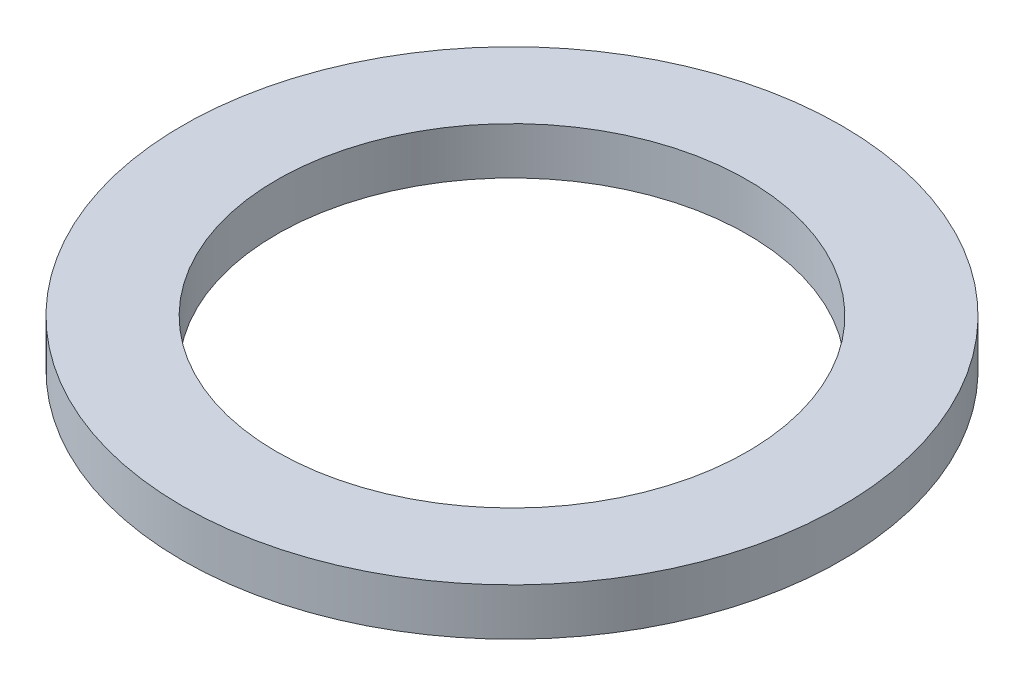
ISO-10303-21;
HEADER;
FILE_DESCRIPTION(('STEP AP214'),'2;1');
FILE_NAME('part.step','',(''),(''),'','','');
FILE_SCHEMA(('AUTOMOTIVE_DESIGN { 1 0 10303 214 1 1 1 1 }'));
ENDSEC;
DATA;
#1=APPLICATION_CONTEXT('core data for automotive mechanical design processes');
#2=APPLICATION_PROTOCOL_DEFINITION('international standard','automotive_design',2000,#1);
#3=PRODUCT_CONTEXT('',#1,'mechanical');
#4=PRODUCT('Part','Part','',(#3));
#5=PRODUCT_RELATED_PRODUCT_CATEGORY('part','',(#4));
#6=PRODUCT_DEFINITION_FORMATION('','',#4);
#7=PRODUCT_DEFINITION_CONTEXT('part definition',#1,'design');
#8=PRODUCT_DEFINITION('design','',#6,#7);
#9=PRODUCT_DEFINITION_SHAPE('','',#8);
#10=(LENGTH_UNIT() NAMED_UNIT(*) SI_UNIT(.MILLI.,.METRE.));
#11=(NAMED_UNIT(*) PLANE_ANGLE_UNIT() SI_UNIT($,.RADIAN.));
#12=(NAMED_UNIT(*) SI_UNIT($,.STERADIAN.) SOLID_ANGLE_UNIT());
#13=UNCERTAINTY_MEASURE_WITH_UNIT(LENGTH_MEASURE(1.E-05),#10,'distance_accuracy_value','');
#14=(GEOMETRIC_REPRESENTATION_CONTEXT(3) GLOBAL_UNCERTAINTY_ASSIGNED_CONTEXT((#13)) GLOBAL_UNIT_ASSIGNED_CONTEXT((#10,
#11,#12)) REPRESENTATION_CONTEXT('',''));
#15=CARTESIAN_POINT('',(0.,0.,0.));
#16=DIRECTION('',(0.,0.,1.));
#17=DIRECTION('',(1.,0.,0.));
#18=AXIS2_PLACEMENT_3D('',#15,#16,#17);
#19=CARTESIAN_POINT('',(0.,5.,0.));
#20=DIRECTION('',(0.,1.,0.));
#21=DIRECTION('',(0.,0.,1.));
#22=AXIS2_PLACEMENT_3D('',#19,#20,#21);
#23=PLANE('',#22);
#24=CARTESIAN_POINT('',(0.,5.,0.));
#25=DIRECTION('',(0.,1.,0.));
#26=DIRECTION('',(0.,0.,1.));
#27=AXIS2_PLACEMENT_3D('',#24,#25,#26);
#28=CIRCLE('',#27,35.);
#29=CARTESIAN_POINT('',(0.,5.,35.));
#30=VERTEX_POINT('',#29);
#31=EDGE_CURVE('E10',#30,#30,#28,.T.);
#32=ORIENTED_EDGE('',*,*,#31,.T.);
#33=EDGE_LOOP('',(#32));
#34=FACE_BOUND('',#33,.T.);
#35=CARTESIAN_POINT('',(0.,5.,0.));
#36=DIRECTION('',(0.,1.,0.));
#37=DIRECTION('',(0.,0.,1.));
#38=AXIS2_PLACEMENT_3D('',#35,#36,#37);
#39=CIRCLE('',#38,25.);
#40=CARTESIAN_POINT('',(0.,5.,25.));
#41=VERTEX_POINT('',#40);
#42=EDGE_CURVE('E41',#41,#41,#39,.T.);
#43=ORIENTED_EDGE('',*,*,#42,.F.);
#44=EDGE_LOOP('',(#43));
#45=FACE_BOUND('',#44,.T.);
#46=ADVANCED_FACE('F30',(#34,#45),#23,.T.);
#47=CARTESIAN_POINT('',(0.,0.,0.));
#48=DIRECTION('',(0.,1.,0.));
#49=DIRECTION('',(0.,0.,1.));
#50=AXIS2_PLACEMENT_3D('',#47,#48,#49);
#51=PLANE('',#50);
#52=CARTESIAN_POINT('',(0.,0.,0.));
#53=DIRECTION('',(0.,1.,0.));
#54=DIRECTION('',(0.,0.,1.));
#55=AXIS2_PLACEMENT_3D('',#52,#53,#54);
#56=CIRCLE('',#55,35.);
#57=CARTESIAN_POINT('',(0.,0.,35.));
#58=VERTEX_POINT('',#57);
#59=EDGE_CURVE('E34',#58,#58,#56,.T.);
#60=ORIENTED_EDGE('',*,*,#59,.F.);
#61=EDGE_LOOP('',(#60));
#62=FACE_BOUND('',#61,.T.);
#63=CARTESIAN_POINT('',(0.,0.,0.));
#64=DIRECTION('',(0.,1.,0.));
#65=DIRECTION('',(0.,0.,1.));
#66=AXIS2_PLACEMENT_3D('',#63,#64,#65);
#67=CIRCLE('',#66,25.);
#68=CARTESIAN_POINT('',(0.,0.,25.));
#69=VERTEX_POINT('',#68);
#70=EDGE_CURVE('E43',#69,#69,#67,.T.);
#71=ORIENTED_EDGE('',*,*,#70,.T.);
#72=EDGE_LOOP('',(#71));
#73=FACE_BOUND('',#72,.T.);
#74=ADVANCED_FACE('F53',(#62,#73),#51,.F.);
#75=CARTESIAN_POINT('',(0.,5.,0.));
#76=DIRECTION('',(0.,-1.,0.));
#77=DIRECTION('',(0.,0.,-1.));
#78=AXIS2_PLACEMENT_3D('',#75,#76,#77);
#79=CYLINDRICAL_SURFACE('',#78,35.);
#80=ORIENTED_EDGE('',*,*,#31,.F.);
#81=EDGE_LOOP('',(#80));
#82=FACE_BOUND('',#81,.T.);
#83=ORIENTED_EDGE('',*,*,#59,.T.);
#84=EDGE_LOOP('',(#83));
#85=FACE_BOUND('',#84,.T.);
#86=ADVANCED_FACE('F32',(#82,#85),#79,.T.);
#87=CARTESIAN_POINT('',(0.,5.,0.));
#88=DIRECTION('',(0.,-1.,0.));
#89=DIRECTION('',(0.,0.,-1.));
#90=AXIS2_PLACEMENT_3D('',#87,#88,#89);
#91=CYLINDRICAL_SURFACE('',#90,25.);
#92=ORIENTED_EDGE('',*,*,#42,.T.);
#93=EDGE_LOOP('',(#92));
#94=FACE_BOUND('',#93,.T.);
#95=ORIENTED_EDGE('',*,*,#70,.F.);
#96=EDGE_LOOP('',(#95));
#97=FACE_BOUND('',#96,.T.);
#98=ADVANCED_FACE('F49',(#94,#97),#91,.F.);
#99=CLOSED_SHELL('',(#46,#74,#86,#98));
#100=MANIFOLD_SOLID_BREP('B2',#99);
#101=ADVANCED_BREP_SHAPE_REPRESENTATION('',(#18,#100),#14);
#102=SHAPE_DEFINITION_REPRESENTATION(#9,#101);
ENDSEC;
END-ISO-10303-21;
